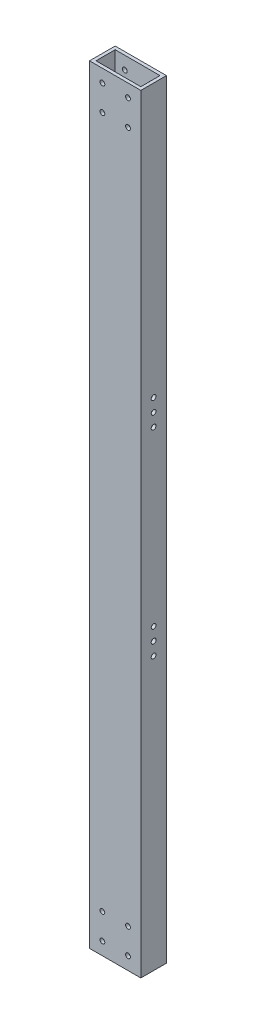
ISO-10303-21;
HEADER;
FILE_DESCRIPTION(('STEP AP214'),'2;1');
FILE_NAME('part.step','',(''),(''),'','','');
FILE_SCHEMA(('AUTOMOTIVE_DESIGN { 1 0 10303 214 1 1 1 1 }'));
ENDSEC;
DATA;
#1=APPLICATION_CONTEXT('core data for automotive mechanical design processes');
#2=APPLICATION_PROTOCOL_DEFINITION('international standard','automotive_design',2000,#1);
#3=PRODUCT_CONTEXT('',#1,'mechanical');
#4=PRODUCT('Part','Part','',(#3));
#5=PRODUCT_RELATED_PRODUCT_CATEGORY('part','',(#4));
#6=PRODUCT_DEFINITION_FORMATION('','',#4);
#7=PRODUCT_DEFINITION_CONTEXT('part definition',#1,'design');
#8=PRODUCT_DEFINITION('design','',#6,#7);
#9=PRODUCT_DEFINITION_SHAPE('','',#8);
#10=(LENGTH_UNIT() NAMED_UNIT(*) SI_UNIT(.MILLI.,.METRE.));
#11=(NAMED_UNIT(*) PLANE_ANGLE_UNIT() SI_UNIT($,.RADIAN.));
#12=(NAMED_UNIT(*) SI_UNIT($,.STERADIAN.) SOLID_ANGLE_UNIT());
#13=UNCERTAINTY_MEASURE_WITH_UNIT(LENGTH_MEASURE(1.E-05),#10,'distance_accuracy_value','');
#14=(GEOMETRIC_REPRESENTATION_CONTEXT(3) GLOBAL_UNCERTAINTY_ASSIGNED_CONTEXT((#13)) GLOBAL_UNIT_ASSIGNED_CONTEXT((#10,
#11,#12)) REPRESENTATION_CONTEXT('',''));
#15=CARTESIAN_POINT('',(0.,0.,0.));
#16=DIRECTION('',(0.,0.,1.));
#17=DIRECTION('',(1.,0.,0.));
#18=AXIS2_PLACEMENT_3D('',#15,#16,#17);
#19=CARTESIAN_POINT('',(0.,381.,0.));
#20=DIRECTION('',(0.,-1.,0.));
#21=DIRECTION('',(0.,0.,-1.));
#22=AXIS2_PLACEMENT_3D('',#19,#20,#21);
#23=PLANE('',#22);
#24=DIRECTION('',(0.,0.,1.));
#25=VECTOR('',#24,1.);
#26=CARTESIAN_POINT('',(-25.4,381.,-12.7));
#27=LINE('',#26,#25);
#28=CARTESIAN_POINT('',(-25.4,381.,-12.7));
#29=VERTEX_POINT('',#28);
#30=CARTESIAN_POINT('',(-25.4,381.,12.7));
#31=VERTEX_POINT('',#30);
#32=EDGE_CURVE('E137',#29,#31,#27,.T.);
#33=ORIENTED_EDGE('',*,*,#32,.T.);
#34=DIRECTION('',(1.,0.,0.));
#35=VECTOR('',#34,1.);
#36=CARTESIAN_POINT('',(25.4,381.,12.7));
#37=LINE('',#36,#35);
#38=CARTESIAN_POINT('',(25.4,381.,12.7));
#39=VERTEX_POINT('',#38);
#40=EDGE_CURVE('E140',#31,#39,#37,.T.);
#41=ORIENTED_EDGE('',*,*,#40,.T.);
#42=DIRECTION('',(0.,0.,-1.));
#43=VECTOR('',#42,1.);
#44=CARTESIAN_POINT('',(25.4,381.,-12.7));
#45=LINE('',#44,#43);
#46=CARTESIAN_POINT('',(25.4,381.,-12.7));
#47=VERTEX_POINT('',#46);
#48=EDGE_CURVE('E143',#39,#47,#45,.T.);
#49=ORIENTED_EDGE('',*,*,#48,.T.);
#50=DIRECTION('',(-1.,0.,0.));
#51=VECTOR('',#50,1.);
#52=CARTESIAN_POINT('',(25.4,381.,-12.7));
#53=LINE('',#52,#51);
#54=EDGE_CURVE('E145',#47,#29,#53,.T.);
#55=ORIENTED_EDGE('',*,*,#54,.T.);
#56=EDGE_LOOP('',(#33,#41,#49,#55));
#57=FACE_BOUND('',#56,.T.);
#58=DIRECTION('',(0.,0.,1.));
#59=VECTOR('',#58,1.);
#60=CARTESIAN_POINT('',(-22.225,381.,0.));
#61=LINE('',#60,#59);
#62=CARTESIAN_POINT('',(-22.225,381.,-9.52500000000001));
#63=VERTEX_POINT('',#62);
#64=CARTESIAN_POINT('',(-22.225,381.,9.52500000000001));
#65=VERTEX_POINT('',#64);
#66=EDGE_CURVE('E125',#63,#65,#61,.T.);
#67=ORIENTED_EDGE('',*,*,#66,.F.);
#68=DIRECTION('',(-1.,0.,0.));
#69=VECTOR('',#68,1.);
#70=CARTESIAN_POINT('',(0.,381.,-9.52500000000001));
#71=LINE('',#70,#69);
#72=CARTESIAN_POINT('',(22.225,381.,-9.52500000000001));
#73=VERTEX_POINT('',#72);
#74=EDGE_CURVE('E109',#73,#63,#71,.T.);
#75=ORIENTED_EDGE('',*,*,#74,.F.);
#76=DIRECTION('',(0.,0.,-1.));
#77=VECTOR('',#76,1.);
#78=CARTESIAN_POINT('',(22.225,381.,0.));
#79=LINE('',#78,#77);
#80=CARTESIAN_POINT('',(22.225,381.,9.52500000000001));
#81=VERTEX_POINT('',#80);
#82=EDGE_CURVE('E134',#81,#73,#79,.T.);
#83=ORIENTED_EDGE('',*,*,#82,.F.);
#84=DIRECTION('',(1.,0.,0.));
#85=VECTOR('',#84,1.);
#86=CARTESIAN_POINT('',(0.,381.,9.52500000000001));
#87=LINE('',#86,#85);
#88=EDGE_CURVE('E127',#65,#81,#87,.T.);
#89=ORIENTED_EDGE('',*,*,#88,.F.);
#90=EDGE_LOOP('',(#67,#75,#83,#89));
#91=FACE_BOUND('',#90,.T.);
#92=ADVANCED_FACE('F37',(#57,#91),#23,.F.);
#93=CARTESIAN_POINT('',(0.,-381.,0.));
#94=DIRECTION('',(0.,-1.,0.));
#95=DIRECTION('',(0.,0.,-1.));
#96=AXIS2_PLACEMENT_3D('',#93,#94,#95);
#97=PLANE('',#96);
#98=DIRECTION('',(0.,0.,1.));
#99=VECTOR('',#98,1.);
#100=CARTESIAN_POINT('',(-25.4,-381.,-12.7));
#101=LINE('',#100,#99);
#102=CARTESIAN_POINT('',(-25.4,-381.,-12.7));
#103=VERTEX_POINT('',#102);
#104=CARTESIAN_POINT('',(-25.4,-381.,12.7));
#105=VERTEX_POINT('',#104);
#106=EDGE_CURVE('E148',#103,#105,#101,.T.);
#107=ORIENTED_EDGE('',*,*,#106,.F.);
#108=DIRECTION('',(-1.,0.,0.));
#109=VECTOR('',#108,1.);
#110=CARTESIAN_POINT('',(25.4,-381.,-12.7));
#111=LINE('',#110,#109);
#112=CARTESIAN_POINT('',(25.4,-381.,-12.7));
#113=VERTEX_POINT('',#112);
#114=EDGE_CURVE('E141',#113,#103,#111,.T.);
#115=ORIENTED_EDGE('',*,*,#114,.F.);
#116=DIRECTION('',(0.,0.,-1.));
#117=VECTOR('',#116,1.);
#118=CARTESIAN_POINT('',(25.4,-381.,-12.7));
#119=LINE('',#118,#117);
#120=CARTESIAN_POINT('',(25.4,-381.,12.7));
#121=VERTEX_POINT('',#120);
#122=EDGE_CURVE('E153',#121,#113,#119,.T.);
#123=ORIENTED_EDGE('',*,*,#122,.F.);
#124=DIRECTION('',(1.,0.,0.));
#125=VECTOR('',#124,1.);
#126=CARTESIAN_POINT('',(25.4,-381.,12.7));
#127=LINE('',#126,#125);
#128=EDGE_CURVE('E151',#105,#121,#127,.T.);
#129=ORIENTED_EDGE('',*,*,#128,.F.);
#130=EDGE_LOOP('',(#107,#115,#123,#129));
#131=FACE_BOUND('',#130,.T.);
#132=DIRECTION('',(-1.,0.,0.));
#133=VECTOR('',#132,1.);
#134=CARTESIAN_POINT('',(0.,-381.,-9.52500000000001));
#135=LINE('',#134,#133);
#136=CARTESIAN_POINT('',(22.225,-381.,-9.52500000000001));
#137=VERTEX_POINT('',#136);
#138=CARTESIAN_POINT('',(-22.225,-381.,-9.52500000000001));
#139=VERTEX_POINT('',#138);
#140=EDGE_CURVE('E107',#137,#139,#135,.T.);
#141=ORIENTED_EDGE('',*,*,#140,.T.);
#142=DIRECTION('',(0.,0.,1.));
#143=VECTOR('',#142,1.);
#144=CARTESIAN_POINT('',(-22.225,-381.,0.));
#145=LINE('',#144,#143);
#146=CARTESIAN_POINT('',(-22.225,-381.,9.52500000000001));
#147=VERTEX_POINT('',#146);
#148=EDGE_CURVE('E115',#139,#147,#145,.T.);
#149=ORIENTED_EDGE('',*,*,#148,.T.);
#150=DIRECTION('',(1.,0.,0.));
#151=VECTOR('',#150,1.);
#152=CARTESIAN_POINT('',(0.,-381.,9.52500000000001));
#153=LINE('',#152,#151);
#154=CARTESIAN_POINT('',(22.225,-381.,9.52500000000001));
#155=VERTEX_POINT('',#154);
#156=EDGE_CURVE('E121',#147,#155,#153,.T.);
#157=ORIENTED_EDGE('',*,*,#156,.T.);
#158=DIRECTION('',(0.,0.,-1.));
#159=VECTOR('',#158,1.);
#160=CARTESIAN_POINT('',(22.225,-381.,0.));
#161=LINE('',#160,#159);
#162=EDGE_CURVE('E61',#155,#137,#161,.T.);
#163=ORIENTED_EDGE('',*,*,#162,.T.);
#164=EDGE_LOOP('',(#141,#149,#157,#163));
#165=FACE_BOUND('',#164,.T.);
#166=ADVANCED_FACE('F124',(#131,#165),#97,.T.);
#167=CARTESIAN_POINT('',(-25.4,381.,-12.7));
#168=DIRECTION('',(1.,0.,0.));
#169=DIRECTION('',(0.,0.,-1.));
#170=AXIS2_PLACEMENT_3D('',#167,#168,#169);
#171=PLANE('',#170);
#172=CARTESIAN_POINT('',(-25.4,110.9345,0.));
#173=DIRECTION('',(1.,0.,0.));
#174=DIRECTION('',(0.,0.,-1.));
#175=AXIS2_PLACEMENT_3D('',#172,#173,#174);
#176=CIRCLE('',#175,2.38125);
#177=CARTESIAN_POINT('',(-25.4,110.9345,-2.38124999999999));
#178=VERTEX_POINT('',#177);
#179=EDGE_CURVE('E167',#178,#178,#176,.T.);
#180=ORIENTED_EDGE('',*,*,#179,.T.);
#181=EDGE_LOOP('',(#180));
#182=FACE_BOUND('',#181,.T.);
#183=CARTESIAN_POINT('',(-25.4,98.2345,0.));
#184=DIRECTION('',(1.,0.,0.));
#185=DIRECTION('',(0.,0.,-1.));
#186=AXIS2_PLACEMENT_3D('',#183,#184,#185);
#187=CIRCLE('',#186,2.38125);
#188=CARTESIAN_POINT('',(-25.4,98.2345,-2.38124999999999));
#189=VERTEX_POINT('',#188);
#190=EDGE_CURVE('E237',#189,#189,#187,.T.);
#191=ORIENTED_EDGE('',*,*,#190,.T.);
#192=EDGE_LOOP('',(#191));
#193=FACE_BOUND('',#192,.T.);
#194=CARTESIAN_POINT('',(-25.4,85.5345,0.));
#195=DIRECTION('',(1.,0.,0.));
#196=DIRECTION('',(0.,0.,-1.));
#197=AXIS2_PLACEMENT_3D('',#194,#195,#196);
#198=CIRCLE('',#197,2.38125);
#199=CARTESIAN_POINT('',(-25.4,85.5345,-2.38124999999999));
#200=VERTEX_POINT('',#199);
#201=EDGE_CURVE('E243',#200,#200,#198,.T.);
#202=ORIENTED_EDGE('',*,*,#201,.T.);
#203=EDGE_LOOP('',(#202));
#204=FACE_BOUND('',#203,.T.);
#205=CARTESIAN_POINT('',(-25.4,-85.5345,0.));
#206=DIRECTION('',(1.,0.,0.));
#207=DIRECTION('',(0.,0.,1.));
#208=AXIS2_PLACEMENT_3D('',#205,#206,#207);
#209=CIRCLE('',#208,2.38125);
#210=CARTESIAN_POINT('',(-25.4,-85.5345,2.38125));
#211=VERTEX_POINT('',#210);
#212=EDGE_CURVE('E249',#211,#211,#209,.T.);
#213=ORIENTED_EDGE('',*,*,#212,.T.);
#214=EDGE_LOOP('',(#213));
#215=FACE_BOUND('',#214,.T.);
#216=CARTESIAN_POINT('',(-25.4,-98.2345,0.));
#217=DIRECTION('',(1.,0.,0.));
#218=DIRECTION('',(0.,0.,1.));
#219=AXIS2_PLACEMENT_3D('',#216,#217,#218);
#220=CIRCLE('',#219,2.38125);
#221=CARTESIAN_POINT('',(-25.4,-98.2345,2.38125));
#222=VERTEX_POINT('',#221);
#223=EDGE_CURVE('E255',#222,#222,#220,.T.);
#224=ORIENTED_EDGE('',*,*,#223,.T.);
#225=EDGE_LOOP('',(#224));
#226=FACE_BOUND('',#225,.T.);
#227=CARTESIAN_POINT('',(-25.4,-110.9345,0.));
#228=DIRECTION('',(1.,0.,0.));
#229=DIRECTION('',(0.,0.,1.));
#230=AXIS2_PLACEMENT_3D('',#227,#228,#229);
#231=CIRCLE('',#230,2.38125);
#232=CARTESIAN_POINT('',(-25.4,-110.9345,2.38125));
#233=VERTEX_POINT('',#232);
#234=EDGE_CURVE('E228',#233,#233,#231,.T.);
#235=ORIENTED_EDGE('',*,*,#234,.T.);
#236=EDGE_LOOP('',(#235));
#237=FACE_BOUND('',#236,.T.);
#238=ORIENTED_EDGE('',*,*,#106,.T.);
#239=DIRECTION('',(0.,-1.,0.));
#240=VECTOR('',#239,1.);
#241=CARTESIAN_POINT('',(-25.4,381.,12.7));
#242=LINE('',#241,#240);
#243=EDGE_CURVE('E11',#31,#105,#242,.T.);
#244=ORIENTED_EDGE('',*,*,#243,.F.);
#245=ORIENTED_EDGE('',*,*,#32,.F.);
#246=DIRECTION('',(0.,-1.,0.));
#247=VECTOR('',#246,1.);
#248=CARTESIAN_POINT('',(-25.4,381.,-12.7));
#249=LINE('',#248,#247);
#250=EDGE_CURVE('E147',#29,#103,#249,.T.);
#251=ORIENTED_EDGE('',*,*,#250,.T.);
#252=EDGE_LOOP('',(#238,#244,#245,#251));
#253=FACE_BOUND('',#252,.T.);
#254=ADVANCED_FACE('F39',(#182,#193,#204,#215,#226,#237,#253),#171,.F.);
#255=CARTESIAN_POINT('',(25.4,381.,12.7));
#256=DIRECTION('',(0.,0.,-1.));
#257=DIRECTION('',(-1.,0.,0.));
#258=AXIS2_PLACEMENT_3D('',#255,#256,#257);
#259=PLANE('',#258);
#260=CARTESIAN_POINT('',(12.7,368.3,12.7));
#261=DIRECTION('',(0.,0.,1.));
#262=DIRECTION('',(1.,0.,0.));
#263=AXIS2_PLACEMENT_3D('',#260,#261,#262);
#264=CIRCLE('',#263,2.38125000000003);
#265=CARTESIAN_POINT('',(15.08125,368.3,12.7));
#266=VERTEX_POINT('',#265);
#267=EDGE_CURVE('E325',#266,#266,#264,.T.);
#268=ORIENTED_EDGE('',*,*,#267,.F.);
#269=EDGE_LOOP('',(#268));
#270=FACE_BOUND('',#269,.T.);
#271=CARTESIAN_POINT('',(12.7,342.9,12.7));
#272=DIRECTION('',(0.,0.,1.));
#273=DIRECTION('',(1.,0.,0.));
#274=AXIS2_PLACEMENT_3D('',#271,#272,#273);
#275=CIRCLE('',#274,2.38125000000003);
#276=CARTESIAN_POINT('',(15.08125,342.9,12.7));
#277=VERTEX_POINT('',#276);
#278=EDGE_CURVE('E329',#277,#277,#275,.T.);
#279=ORIENTED_EDGE('',*,*,#278,.F.);
#280=EDGE_LOOP('',(#279));
#281=FACE_BOUND('',#280,.T.);
#282=CARTESIAN_POINT('',(-12.7,342.9,12.7));
#283=DIRECTION('',(0.,0.,1.));
#284=DIRECTION('',(1.,0.,0.));
#285=AXIS2_PLACEMENT_3D('',#282,#283,#284);
#286=CIRCLE('',#285,2.38125000000003);
#287=CARTESIAN_POINT('',(-10.31875,342.9,12.7));
#288=VERTEX_POINT('',#287);
#289=EDGE_CURVE('E333',#288,#288,#286,.T.);
#290=ORIENTED_EDGE('',*,*,#289,.F.);
#291=EDGE_LOOP('',(#290));
#292=FACE_BOUND('',#291,.T.);
#293=CARTESIAN_POINT('',(-12.7,-342.9,12.7));
#294=DIRECTION('',(0.,0.,1.));
#295=DIRECTION('',(-1.,0.,0.));
#296=AXIS2_PLACEMENT_3D('',#293,#294,#295);
#297=CIRCLE('',#296,2.38125000000003);
#298=CARTESIAN_POINT('',(-15.08125,-342.9,12.7));
#299=VERTEX_POINT('',#298);
#300=EDGE_CURVE('E337',#299,#299,#297,.T.);
#301=ORIENTED_EDGE('',*,*,#300,.F.);
#302=EDGE_LOOP('',(#301));
#303=FACE_BOUND('',#302,.T.);
#304=CARTESIAN_POINT('',(12.7,-342.9,12.7));
#305=DIRECTION('',(0.,0.,1.));
#306=DIRECTION('',(-1.,0.,0.));
#307=AXIS2_PLACEMENT_3D('',#304,#305,#306);
#308=CIRCLE('',#307,2.38125000000003);
#309=CARTESIAN_POINT('',(10.31875,-342.9,12.7));
#310=VERTEX_POINT('',#309);
#311=EDGE_CURVE('E341',#310,#310,#308,.T.);
#312=ORIENTED_EDGE('',*,*,#311,.F.);
#313=EDGE_LOOP('',(#312));
#314=FACE_BOUND('',#313,.T.);
#315=CARTESIAN_POINT('',(12.7,-368.3,12.7));
#316=DIRECTION('',(0.,0.,1.));
#317=DIRECTION('',(-1.,0.,0.));
#318=AXIS2_PLACEMENT_3D('',#315,#316,#317);
#319=CIRCLE('',#318,2.38125000000003);
#320=CARTESIAN_POINT('',(10.31875,-368.3,12.7));
#321=VERTEX_POINT('',#320);
#322=EDGE_CURVE('E345',#321,#321,#319,.T.);
#323=ORIENTED_EDGE('',*,*,#322,.F.);
#324=EDGE_LOOP('',(#323));
#325=FACE_BOUND('',#324,.T.);
#326=CARTESIAN_POINT('',(-12.7,-368.3,12.7));
#327=DIRECTION('',(0.,0.,1.));
#328=DIRECTION('',(-1.,0.,0.));
#329=AXIS2_PLACEMENT_3D('',#326,#327,#328);
#330=CIRCLE('',#329,2.38125000000003);
#331=CARTESIAN_POINT('',(-15.08125,-368.3,12.7));
#332=VERTEX_POINT('',#331);
#333=EDGE_CURVE('E349',#332,#332,#330,.T.);
#334=ORIENTED_EDGE('',*,*,#333,.F.);
#335=EDGE_LOOP('',(#334));
#336=FACE_BOUND('',#335,.T.);
#337=CARTESIAN_POINT('',(-12.7,368.3,12.7));
#338=DIRECTION('',(0.,0.,1.));
#339=DIRECTION('',(1.,0.,0.));
#340=AXIS2_PLACEMENT_3D('',#337,#338,#339);
#341=CIRCLE('',#340,2.38125000000003);
#342=CARTESIAN_POINT('',(-10.31875,368.3,12.7));
#343=VERTEX_POINT('',#342);
#344=EDGE_CURVE('E353',#343,#343,#341,.T.);
#345=ORIENTED_EDGE('',*,*,#344,.F.);
#346=EDGE_LOOP('',(#345));
#347=FACE_BOUND('',#346,.T.);
#348=ORIENTED_EDGE('',*,*,#128,.T.);
#349=DIRECTION('',(0.,-1.,0.));
#350=VECTOR('',#349,1.);
#351=CARTESIAN_POINT('',(25.4,381.,12.7));
#352=LINE('',#351,#350);
#353=EDGE_CURVE('E46',#39,#121,#352,.T.);
#354=ORIENTED_EDGE('',*,*,#353,.F.);
#355=ORIENTED_EDGE('',*,*,#40,.F.);
#356=ORIENTED_EDGE('',*,*,#243,.T.);
#357=EDGE_LOOP('',(#348,#354,#355,#356));
#358=FACE_BOUND('',#357,.T.);
#359=ADVANCED_FACE('F313',(#270,#281,#292,#303,#314,#325,#336,#347,#358),#259,.F.);
#360=CARTESIAN_POINT('',(25.4,381.,-12.7));
#361=DIRECTION('',(-1.,0.,0.));
#362=DIRECTION('',(0.,0.,1.));
#363=AXIS2_PLACEMENT_3D('',#360,#361,#362);
#364=PLANE('',#363);
#365=CARTESIAN_POINT('',(25.4,110.9345,0.));
#366=DIRECTION('',(1.,0.,0.));
#367=DIRECTION('',(0.,0.,-1.));
#368=AXIS2_PLACEMENT_3D('',#365,#366,#367);
#369=CIRCLE('',#368,2.38125);
#370=CARTESIAN_POINT('',(25.4,110.9345,-2.38125));
#371=VERTEX_POINT('',#370);
#372=EDGE_CURVE('E231',#371,#371,#369,.T.);
#373=ORIENTED_EDGE('',*,*,#372,.F.);
#374=EDGE_LOOP('',(#373));
#375=FACE_BOUND('',#374,.T.);
#376=CARTESIAN_POINT('',(25.4,98.2345,0.));
#377=DIRECTION('',(1.,0.,0.));
#378=DIRECTION('',(0.,0.,-1.));
#379=AXIS2_PLACEMENT_3D('',#376,#377,#378);
#380=CIRCLE('',#379,2.38125);
#381=CARTESIAN_POINT('',(25.4,98.2345,-2.38125));
#382=VERTEX_POINT('',#381);
#383=EDGE_CURVE('E234',#382,#382,#380,.T.);
#384=ORIENTED_EDGE('',*,*,#383,.F.);
#385=EDGE_LOOP('',(#384));
#386=FACE_BOUND('',#385,.T.);
#387=CARTESIAN_POINT('',(25.4,85.5345,0.));
#388=DIRECTION('',(1.,0.,0.));
#389=DIRECTION('',(0.,0.,-1.));
#390=AXIS2_PLACEMENT_3D('',#387,#388,#389);
#391=CIRCLE('',#390,2.38125);
#392=CARTESIAN_POINT('',(25.4,85.5345,-2.38125));
#393=VERTEX_POINT('',#392);
#394=EDGE_CURVE('E240',#393,#393,#391,.T.);
#395=ORIENTED_EDGE('',*,*,#394,.F.);
#396=EDGE_LOOP('',(#395));
#397=FACE_BOUND('',#396,.T.);
#398=CARTESIAN_POINT('',(25.4,-85.5345,0.));
#399=DIRECTION('',(1.,0.,0.));
#400=DIRECTION('',(0.,0.,1.));
#401=AXIS2_PLACEMENT_3D('',#398,#399,#400);
#402=CIRCLE('',#401,2.38125);
#403=CARTESIAN_POINT('',(25.4,-85.5345,2.38125));
#404=VERTEX_POINT('',#403);
#405=EDGE_CURVE('E246',#404,#404,#402,.T.);
#406=ORIENTED_EDGE('',*,*,#405,.F.);
#407=EDGE_LOOP('',(#406));
#408=FACE_BOUND('',#407,.T.);
#409=CARTESIAN_POINT('',(25.4,-98.2345,0.));
#410=DIRECTION('',(1.,0.,0.));
#411=DIRECTION('',(0.,0.,1.));
#412=AXIS2_PLACEMENT_3D('',#409,#410,#411);
#413=CIRCLE('',#412,2.38125);
#414=CARTESIAN_POINT('',(25.4,-98.2345,2.38124999999999));
#415=VERTEX_POINT('',#414);
#416=EDGE_CURVE('E252',#415,#415,#413,.T.);
#417=ORIENTED_EDGE('',*,*,#416,.F.);
#418=EDGE_LOOP('',(#417));
#419=FACE_BOUND('',#418,.T.);
#420=CARTESIAN_POINT('',(25.4,-110.9345,0.));
#421=DIRECTION('',(1.,0.,0.));
#422=DIRECTION('',(0.,0.,1.));
#423=AXIS2_PLACEMENT_3D('',#420,#421,#422);
#424=CIRCLE('',#423,2.38125);
#425=CARTESIAN_POINT('',(25.4,-110.9345,2.38124999999999));
#426=VERTEX_POINT('',#425);
#427=EDGE_CURVE('E258',#426,#426,#424,.T.);
#428=ORIENTED_EDGE('',*,*,#427,.F.);
#429=EDGE_LOOP('',(#428));
#430=FACE_BOUND('',#429,.T.);
#431=ORIENTED_EDGE('',*,*,#122,.T.);
#432=DIRECTION('',(0.,-1.,0.));
#433=VECTOR('',#432,1.);
#434=CARTESIAN_POINT('',(25.4,381.,-12.7));
#435=LINE('',#434,#433);
#436=EDGE_CURVE('E158',#47,#113,#435,.T.);
#437=ORIENTED_EDGE('',*,*,#436,.F.);
#438=ORIENTED_EDGE('',*,*,#48,.F.);
#439=ORIENTED_EDGE('',*,*,#353,.T.);
#440=EDGE_LOOP('',(#431,#437,#438,#439));
#441=FACE_BOUND('',#440,.T.);
#442=ADVANCED_FACE('F310',(#375,#386,#397,#408,#419,#430,#441),#364,.F.);
#443=CARTESIAN_POINT('',(25.4,381.,-12.7));
#444=DIRECTION('',(0.,0.,1.));
#445=DIRECTION('',(1.,0.,0.));
#446=AXIS2_PLACEMENT_3D('',#443,#444,#445);
#447=PLANE('',#446);
#448=CARTESIAN_POINT('',(12.7,368.3,-12.7));
#449=DIRECTION('',(0.,0.,1.));
#450=DIRECTION('',(1.,0.,0.));
#451=AXIS2_PLACEMENT_3D('',#448,#449,#450);
#452=CIRCLE('',#451,2.38125000000003);
#453=CARTESIAN_POINT('',(15.08125,368.3,-12.7));
#454=VERTEX_POINT('',#453);
#455=EDGE_CURVE('E371',#454,#454,#452,.T.);
#456=ORIENTED_EDGE('',*,*,#455,.T.);
#457=EDGE_LOOP('',(#456));
#458=FACE_BOUND('',#457,.T.);
#459=CARTESIAN_POINT('',(12.7,342.9,-12.7));
#460=DIRECTION('',(0.,0.,1.));
#461=DIRECTION('',(1.,0.,0.));
#462=AXIS2_PLACEMENT_3D('',#459,#460,#461);
#463=CIRCLE('',#462,2.38125000000003);
#464=CARTESIAN_POINT('',(15.08125,342.9,-12.7));
#465=VERTEX_POINT('',#464);
#466=EDGE_CURVE('E465',#465,#465,#463,.T.);
#467=ORIENTED_EDGE('',*,*,#466,.T.);
#468=EDGE_LOOP('',(#467));
#469=FACE_BOUND('',#468,.T.);
#470=CARTESIAN_POINT('',(-12.7,342.9,-12.7));
#471=DIRECTION('',(0.,0.,1.));
#472=DIRECTION('',(1.,0.,0.));
#473=AXIS2_PLACEMENT_3D('',#470,#471,#472);
#474=CIRCLE('',#473,2.38125000000003);
#475=CARTESIAN_POINT('',(-10.31875,342.9,-12.7));
#476=VERTEX_POINT('',#475);
#477=EDGE_CURVE('E469',#476,#476,#474,.T.);
#478=ORIENTED_EDGE('',*,*,#477,.T.);
#479=EDGE_LOOP('',(#478));
#480=FACE_BOUND('',#479,.T.);
#481=CARTESIAN_POINT('',(-12.7,-342.9,-12.7));
#482=DIRECTION('',(0.,0.,1.));
#483=DIRECTION('',(-1.,0.,0.));
#484=AXIS2_PLACEMENT_3D('',#481,#482,#483);
#485=CIRCLE('',#484,2.38125000000003);
#486=CARTESIAN_POINT('',(-15.08125,-342.9,-12.7));
#487=VERTEX_POINT('',#486);
#488=EDGE_CURVE('E472',#487,#487,#485,.T.);
#489=ORIENTED_EDGE('',*,*,#488,.T.);
#490=EDGE_LOOP('',(#489));
#491=FACE_BOUND('',#490,.T.);
#492=CARTESIAN_POINT('',(12.7,-342.9,-12.7));
#493=DIRECTION('',(0.,0.,1.));
#494=DIRECTION('',(-1.,0.,0.));
#495=AXIS2_PLACEMENT_3D('',#492,#493,#494);
#496=CIRCLE('',#495,2.38125000000003);
#497=CARTESIAN_POINT('',(10.31875,-342.9,-12.7));
#498=VERTEX_POINT('',#497);
#499=EDGE_CURVE('E476',#498,#498,#496,.T.);
#500=ORIENTED_EDGE('',*,*,#499,.T.);
#501=EDGE_LOOP('',(#500));
#502=FACE_BOUND('',#501,.T.);
#503=CARTESIAN_POINT('',(12.7,-368.3,-12.7));
#504=DIRECTION('',(0.,0.,1.));
#505=DIRECTION('',(-1.,0.,0.));
#506=AXIS2_PLACEMENT_3D('',#503,#504,#505);
#507=CIRCLE('',#506,2.38125000000003);
#508=CARTESIAN_POINT('',(10.31875,-368.3,-12.7));
#509=VERTEX_POINT('',#508);
#510=EDGE_CURVE('E458',#509,#509,#507,.T.);
#511=ORIENTED_EDGE('',*,*,#510,.T.);
#512=EDGE_LOOP('',(#511));
#513=FACE_BOUND('',#512,.T.);
#514=CARTESIAN_POINT('',(-12.7,-368.3,-12.7));
#515=DIRECTION('',(0.,0.,1.));
#516=DIRECTION('',(-1.,0.,0.));
#517=AXIS2_PLACEMENT_3D('',#514,#515,#516);
#518=CIRCLE('',#517,2.38125000000003);
#519=CARTESIAN_POINT('',(-15.08125,-368.3,-12.7));
#520=VERTEX_POINT('',#519);
#521=EDGE_CURVE('E455',#520,#520,#518,.T.);
#522=ORIENTED_EDGE('',*,*,#521,.T.);
#523=EDGE_LOOP('',(#522));
#524=FACE_BOUND('',#523,.T.);
#525=CARTESIAN_POINT('',(-12.7,368.3,-12.7));
#526=DIRECTION('',(0.,0.,1.));
#527=DIRECTION('',(1.,0.,0.));
#528=AXIS2_PLACEMENT_3D('',#525,#526,#527);
#529=CIRCLE('',#528,2.38125000000003);
#530=CARTESIAN_POINT('',(-10.31875,368.3,-12.7));
#531=VERTEX_POINT('',#530);
#532=EDGE_CURVE('E191',#531,#531,#529,.T.);
#533=ORIENTED_EDGE('',*,*,#532,.T.);
#534=EDGE_LOOP('',(#533));
#535=FACE_BOUND('',#534,.T.);
#536=ORIENTED_EDGE('',*,*,#114,.T.);
#537=ORIENTED_EDGE('',*,*,#250,.F.);
#538=ORIENTED_EDGE('',*,*,#54,.F.);
#539=ORIENTED_EDGE('',*,*,#436,.T.);
#540=EDGE_LOOP('',(#536,#537,#538,#539));
#541=FACE_BOUND('',#540,.T.);
#542=ADVANCED_FACE('F294',(#458,#469,#480,#491,#502,#513,#524,#535,#541),#447,.F.);
#543=CARTESIAN_POINT('',(-22.225,381.,-12.7));
#544=DIRECTION('',(1.,0.,0.));
#545=DIRECTION('',(0.,0.,-1.));
#546=AXIS2_PLACEMENT_3D('',#543,#544,#545);
#547=PLANE('',#546);
#548=CARTESIAN_POINT('',(-22.225,110.9345,0.));
#549=DIRECTION('',(1.,0.,0.));
#550=DIRECTION('',(0.,0.,-1.));
#551=AXIS2_PLACEMENT_3D('',#548,#549,#550);
#552=CIRCLE('',#551,2.38125);
#553=CARTESIAN_POINT('',(-22.225,110.9345,-2.38124999999999));
#554=VERTEX_POINT('',#553);
#555=EDGE_CURVE('E122',#554,#554,#552,.T.);
#556=ORIENTED_EDGE('',*,*,#555,.F.);
#557=EDGE_LOOP('',(#556));
#558=FACE_BOUND('',#557,.T.);
#559=CARTESIAN_POINT('',(-22.225,98.2345,0.));
#560=DIRECTION('',(1.,0.,0.));
#561=DIRECTION('',(0.,0.,-1.));
#562=AXIS2_PLACEMENT_3D('',#559,#560,#561);
#563=CIRCLE('',#562,2.38125);
#564=CARTESIAN_POINT('',(-22.225,98.2345,-2.38124999999999));
#565=VERTEX_POINT('',#564);
#566=EDGE_CURVE('E183',#565,#565,#563,.T.);
#567=ORIENTED_EDGE('',*,*,#566,.F.);
#568=EDGE_LOOP('',(#567));
#569=FACE_BOUND('',#568,.T.);
#570=CARTESIAN_POINT('',(-22.225,85.5345,0.));
#571=DIRECTION('',(1.,0.,0.));
#572=DIRECTION('',(0.,0.,-1.));
#573=AXIS2_PLACEMENT_3D('',#570,#571,#572);
#574=CIRCLE('',#573,2.38125);
#575=CARTESIAN_POINT('',(-22.225,85.5345,-2.38124999999999));
#576=VERTEX_POINT('',#575);
#577=EDGE_CURVE('E179',#576,#576,#574,.T.);
#578=ORIENTED_EDGE('',*,*,#577,.F.);
#579=EDGE_LOOP('',(#578));
#580=FACE_BOUND('',#579,.T.);
#581=CARTESIAN_POINT('',(-22.225,-85.5345,0.));
#582=DIRECTION('',(1.,0.,0.));
#583=DIRECTION('',(0.,0.,-1.));
#584=AXIS2_PLACEMENT_3D('',#581,#582,#583);
#585=CIRCLE('',#584,2.38125);
#586=CARTESIAN_POINT('',(-22.225,-85.5345,-2.38124999999999));
#587=VERTEX_POINT('',#586);
#588=EDGE_CURVE('E175',#587,#587,#585,.T.);
#589=ORIENTED_EDGE('',*,*,#588,.F.);
#590=EDGE_LOOP('',(#589));
#591=FACE_BOUND('',#590,.T.);
#592=CARTESIAN_POINT('',(-22.225,-98.2345,0.));
#593=DIRECTION('',(1.,0.,0.));
#594=DIRECTION('',(0.,0.,-1.));
#595=AXIS2_PLACEMENT_3D('',#592,#593,#594);
#596=CIRCLE('',#595,2.38125);
#597=CARTESIAN_POINT('',(-22.225,-98.2345,-2.38124999999999));
#598=VERTEX_POINT('',#597);
#599=EDGE_CURVE('E171',#598,#598,#596,.T.);
#600=ORIENTED_EDGE('',*,*,#599,.F.);
#601=EDGE_LOOP('',(#600));
#602=FACE_BOUND('',#601,.T.);
#603=CARTESIAN_POINT('',(-22.225,-110.9345,0.));
#604=DIRECTION('',(1.,0.,0.));
#605=DIRECTION('',(0.,0.,-1.));
#606=AXIS2_PLACEMENT_3D('',#603,#604,#605);
#607=CIRCLE('',#606,2.38125);
#608=CARTESIAN_POINT('',(-22.225,-110.9345,-2.38124999999999));
#609=VERTEX_POINT('',#608);
#610=EDGE_CURVE('E166',#609,#609,#607,.T.);
#611=ORIENTED_EDGE('',*,*,#610,.F.);
#612=EDGE_LOOP('',(#611));
#613=FACE_BOUND('',#612,.T.);
#614=ORIENTED_EDGE('',*,*,#148,.F.);
#615=DIRECTION('',(0.,-1.,0.));
#616=VECTOR('',#615,1.);
#617=CARTESIAN_POINT('',(-22.225,381.,-9.52500000000001));
#618=LINE('',#617,#616);
#619=EDGE_CURVE('E103',#63,#139,#618,.T.);
#620=ORIENTED_EDGE('',*,*,#619,.F.);
#621=ORIENTED_EDGE('',*,*,#66,.T.);
#622=DIRECTION('',(0.,-1.,0.));
#623=VECTOR('',#622,1.);
#624=CARTESIAN_POINT('',(-22.225,381.,9.52500000000001));
#625=LINE('',#624,#623);
#626=EDGE_CURVE('E118',#65,#147,#625,.T.);
#627=ORIENTED_EDGE('',*,*,#626,.T.);
#628=EDGE_LOOP('',(#614,#620,#621,#627));
#629=FACE_BOUND('',#628,.T.);
#630=ADVANCED_FACE('F116',(#558,#569,#580,#591,#602,#613,#629),#547,.T.);
#631=CARTESIAN_POINT('',(25.4,381.,9.52500000000001));
#632=DIRECTION('',(0.,0.,-1.));
#633=DIRECTION('',(-1.,0.,0.));
#634=AXIS2_PLACEMENT_3D('',#631,#632,#633);
#635=PLANE('',#634);
#636=CARTESIAN_POINT('',(12.7,368.3,9.52500000000001));
#637=DIRECTION('',(0.,0.,-1.));
#638=DIRECTION('',(-1.,0.,0.));
#639=AXIS2_PLACEMENT_3D('',#636,#637,#638);
#640=CIRCLE('',#639,2.38125000000003);
#641=CARTESIAN_POINT('',(10.31875,368.3,9.52500000000001));
#642=VERTEX_POINT('',#641);
#643=EDGE_CURVE('E225',#642,#642,#640,.T.);
#644=ORIENTED_EDGE('',*,*,#643,.F.);
#645=EDGE_LOOP('',(#644));
#646=FACE_BOUND('',#645,.T.);
#647=CARTESIAN_POINT('',(12.7,342.9,9.52500000000001));
#648=DIRECTION('',(0.,0.,-1.));
#649=DIRECTION('',(-1.,0.,0.));
#650=AXIS2_PLACEMENT_3D('',#647,#648,#649);
#651=CIRCLE('',#650,2.38125000000003);
#652=CARTESIAN_POINT('',(10.31875,342.9,9.52500000000001));
#653=VERTEX_POINT('',#652);
#654=EDGE_CURVE('E213',#653,#653,#651,.T.);
#655=ORIENTED_EDGE('',*,*,#654,.F.);
#656=EDGE_LOOP('',(#655));
#657=FACE_BOUND('',#656,.T.);
#658=CARTESIAN_POINT('',(-12.7,342.9,9.52500000000001));
#659=DIRECTION('',(0.,0.,-1.));
#660=DIRECTION('',(-1.,0.,0.));
#661=AXIS2_PLACEMENT_3D('',#658,#659,#660);
#662=CIRCLE('',#661,2.38125000000003);
#663=CARTESIAN_POINT('',(-15.08125,342.9,9.52500000000001));
#664=VERTEX_POINT('',#663);
#665=EDGE_CURVE('E210',#664,#664,#662,.T.);
#666=ORIENTED_EDGE('',*,*,#665,.F.);
#667=EDGE_LOOP('',(#666));
#668=FACE_BOUND('',#667,.T.);
#669=CARTESIAN_POINT('',(-12.7,-342.9,9.52500000000001));
#670=DIRECTION('',(0.,0.,-1.));
#671=DIRECTION('',(-1.,0.,0.));
#672=AXIS2_PLACEMENT_3D('',#669,#670,#671);
#673=CIRCLE('',#672,2.38125000000003);
#674=CARTESIAN_POINT('',(-15.08125,-342.9,9.52500000000001));
#675=VERTEX_POINT('',#674);
#676=EDGE_CURVE('E207',#675,#675,#673,.T.);
#677=ORIENTED_EDGE('',*,*,#676,.F.);
#678=EDGE_LOOP('',(#677));
#679=FACE_BOUND('',#678,.T.);
#680=CARTESIAN_POINT('',(12.7,-342.9,9.52500000000001));
#681=DIRECTION('',(0.,0.,-1.));
#682=DIRECTION('',(-1.,0.,0.));
#683=AXIS2_PLACEMENT_3D('',#680,#681,#682);
#684=CIRCLE('',#683,2.38125000000003);
#685=CARTESIAN_POINT('',(10.31875,-342.9,9.52500000000001));
#686=VERTEX_POINT('',#685);
#687=EDGE_CURVE('E203',#686,#686,#684,.T.);
#688=ORIENTED_EDGE('',*,*,#687,.F.);
#689=EDGE_LOOP('',(#688));
#690=FACE_BOUND('',#689,.T.);
#691=CARTESIAN_POINT('',(12.7,-368.3,9.52500000000001));
#692=DIRECTION('',(0.,0.,-1.));
#693=DIRECTION('',(-1.,0.,0.));
#694=AXIS2_PLACEMENT_3D('',#691,#692,#693);
#695=CIRCLE('',#694,2.38125000000003);
#696=CARTESIAN_POINT('',(10.31875,-368.3,9.52500000000001));
#697=VERTEX_POINT('',#696);
#698=EDGE_CURVE('E199',#697,#697,#695,.T.);
#699=ORIENTED_EDGE('',*,*,#698,.F.);
#700=EDGE_LOOP('',(#699));
#701=FACE_BOUND('',#700,.T.);
#702=CARTESIAN_POINT('',(-12.7,-368.3,9.52500000000001));
#703=DIRECTION('',(0.,0.,-1.));
#704=DIRECTION('',(-1.,0.,0.));
#705=AXIS2_PLACEMENT_3D('',#702,#703,#704);
#706=CIRCLE('',#705,2.38125000000003);
#707=CARTESIAN_POINT('',(-15.08125,-368.3,9.52500000000001));
#708=VERTEX_POINT('',#707);
#709=EDGE_CURVE('E195',#708,#708,#706,.T.);
#710=ORIENTED_EDGE('',*,*,#709,.F.);
#711=EDGE_LOOP('',(#710));
#712=FACE_BOUND('',#711,.T.);
#713=CARTESIAN_POINT('',(-12.7,368.3,9.52500000000001));
#714=DIRECTION('',(0.,0.,-1.));
#715=DIRECTION('',(-1.,0.,0.));
#716=AXIS2_PLACEMENT_3D('',#713,#714,#715);
#717=CIRCLE('',#716,2.38125000000003);
#718=CARTESIAN_POINT('',(-15.08125,368.3,9.52500000000001));
#719=VERTEX_POINT('',#718);
#720=EDGE_CURVE('E190',#719,#719,#717,.T.);
#721=ORIENTED_EDGE('',*,*,#720,.F.);
#722=EDGE_LOOP('',(#721));
#723=FACE_BOUND('',#722,.T.);
#724=ORIENTED_EDGE('',*,*,#156,.F.);
#725=ORIENTED_EDGE('',*,*,#626,.F.);
#726=ORIENTED_EDGE('',*,*,#88,.T.);
#727=DIRECTION('',(0.,-1.,0.));
#728=VECTOR('',#727,1.);
#729=CARTESIAN_POINT('',(22.225,381.,9.52500000000001));
#730=LINE('',#729,#728);
#731=EDGE_CURVE('E275',#81,#155,#730,.T.);
#732=ORIENTED_EDGE('',*,*,#731,.T.);
#733=EDGE_LOOP('',(#724,#725,#726,#732));
#734=FACE_BOUND('',#733,.T.);
#735=ADVANCED_FACE('F282',(#646,#657,#668,#679,#690,#701,#712,#723,#734),#635,.T.);
#736=CARTESIAN_POINT('',(22.225,381.,-12.7));
#737=DIRECTION('',(-1.,0.,0.));
#738=DIRECTION('',(0.,0.,1.));
#739=AXIS2_PLACEMENT_3D('',#736,#737,#738);
#740=PLANE('',#739);
#741=CARTESIAN_POINT('',(22.225,110.9345,0.));
#742=DIRECTION('',(-1.,0.,0.));
#743=DIRECTION('',(0.,0.,1.));
#744=AXIS2_PLACEMENT_3D('',#741,#742,#743);
#745=CIRCLE('',#744,2.38125);
#746=CARTESIAN_POINT('',(22.225,110.9345,2.38124999999999));
#747=VERTEX_POINT('',#746);
#748=EDGE_CURVE('E184',#747,#747,#745,.T.);
#749=ORIENTED_EDGE('',*,*,#748,.F.);
#750=EDGE_LOOP('',(#749));
#751=FACE_BOUND('',#750,.T.);
#752=CARTESIAN_POINT('',(22.225,98.2345,0.));
#753=DIRECTION('',(-1.,0.,0.));
#754=DIRECTION('',(0.,0.,1.));
#755=AXIS2_PLACEMENT_3D('',#752,#753,#754);
#756=CIRCLE('',#755,2.38125);
#757=CARTESIAN_POINT('',(22.225,98.2345,2.38124999999999));
#758=VERTEX_POINT('',#757);
#759=EDGE_CURVE('E180',#758,#758,#756,.T.);
#760=ORIENTED_EDGE('',*,*,#759,.F.);
#761=EDGE_LOOP('',(#760));
#762=FACE_BOUND('',#761,.T.);
#763=CARTESIAN_POINT('',(22.225,85.5345,0.));
#764=DIRECTION('',(-1.,0.,0.));
#765=DIRECTION('',(0.,0.,1.));
#766=AXIS2_PLACEMENT_3D('',#763,#764,#765);
#767=CIRCLE('',#766,2.38125);
#768=CARTESIAN_POINT('',(22.225,85.5345,2.38125));
#769=VERTEX_POINT('',#768);
#770=EDGE_CURVE('E176',#769,#769,#767,.T.);
#771=ORIENTED_EDGE('',*,*,#770,.F.);
#772=EDGE_LOOP('',(#771));
#773=FACE_BOUND('',#772,.T.);
#774=CARTESIAN_POINT('',(22.225,-85.5345,0.));
#775=DIRECTION('',(-1.,0.,0.));
#776=DIRECTION('',(0.,0.,1.));
#777=AXIS2_PLACEMENT_3D('',#774,#775,#776);
#778=CIRCLE('',#777,2.38125);
#779=CARTESIAN_POINT('',(22.225,-85.5345,2.38125));
#780=VERTEX_POINT('',#779);
#781=EDGE_CURVE('E172',#780,#780,#778,.T.);
#782=ORIENTED_EDGE('',*,*,#781,.F.);
#783=EDGE_LOOP('',(#782));
#784=FACE_BOUND('',#783,.T.);
#785=CARTESIAN_POINT('',(22.225,-98.2345,0.));
#786=DIRECTION('',(-1.,0.,0.));
#787=DIRECTION('',(0.,0.,1.));
#788=AXIS2_PLACEMENT_3D('',#785,#786,#787);
#789=CIRCLE('',#788,2.38125);
#790=CARTESIAN_POINT('',(22.225,-98.2345,2.38124999999999));
#791=VERTEX_POINT('',#790);
#792=EDGE_CURVE('E168',#791,#791,#789,.T.);
#793=ORIENTED_EDGE('',*,*,#792,.F.);
#794=EDGE_LOOP('',(#793));
#795=FACE_BOUND('',#794,.T.);
#796=CARTESIAN_POINT('',(22.225,-110.9345,0.));
#797=DIRECTION('',(-1.,0.,0.));
#798=DIRECTION('',(0.,0.,1.));
#799=AXIS2_PLACEMENT_3D('',#796,#797,#798);
#800=CIRCLE('',#799,2.38125);
#801=CARTESIAN_POINT('',(22.225,-110.9345,2.38124999999999));
#802=VERTEX_POINT('',#801);
#803=EDGE_CURVE('E163',#802,#802,#800,.T.);
#804=ORIENTED_EDGE('',*,*,#803,.F.);
#805=EDGE_LOOP('',(#804));
#806=FACE_BOUND('',#805,.T.);
#807=ORIENTED_EDGE('',*,*,#162,.F.);
#808=ORIENTED_EDGE('',*,*,#731,.F.);
#809=ORIENTED_EDGE('',*,*,#82,.T.);
#810=DIRECTION('',(0.,-1.,0.));
#811=VECTOR('',#810,1.);
#812=CARTESIAN_POINT('',(22.225,381.,-9.52500000000001));
#813=LINE('',#812,#811);
#814=EDGE_CURVE('E54',#73,#137,#813,.T.);
#815=ORIENTED_EDGE('',*,*,#814,.T.);
#816=EDGE_LOOP('',(#807,#808,#809,#815));
#817=FACE_BOUND('',#816,.T.);
#818=ADVANCED_FACE('F277',(#751,#762,#773,#784,#795,#806,#817),#740,.T.);
#819=CARTESIAN_POINT('',(25.4,381.,-9.52500000000001));
#820=DIRECTION('',(0.,0.,1.));
#821=DIRECTION('',(1.,0.,0.));
#822=AXIS2_PLACEMENT_3D('',#819,#820,#821);
#823=PLANE('',#822);
#824=CARTESIAN_POINT('',(12.7,368.3,-9.52500000000001));
#825=DIRECTION('',(0.,0.,1.));
#826=DIRECTION('',(1.,0.,0.));
#827=AXIS2_PLACEMENT_3D('',#824,#825,#826);
#828=CIRCLE('',#827,2.38125000000003);
#829=CARTESIAN_POINT('',(15.08125,368.3,-9.52500000000001));
#830=VERTEX_POINT('',#829);
#831=EDGE_CURVE('E41',#830,#830,#828,.T.);
#832=ORIENTED_EDGE('',*,*,#831,.F.);
#833=EDGE_LOOP('',(#832));
#834=FACE_BOUND('',#833,.T.);
#835=CARTESIAN_POINT('',(12.7,342.9,-9.52500000000001));
#836=DIRECTION('',(0.,0.,1.));
#837=DIRECTION('',(1.,0.,0.));
#838=AXIS2_PLACEMENT_3D('',#835,#836,#837);
#839=CIRCLE('',#838,2.38125000000003);
#840=CARTESIAN_POINT('',(15.08125,342.9,-9.52500000000001));
#841=VERTEX_POINT('',#840);
#842=EDGE_CURVE('E211',#841,#841,#839,.T.);
#843=ORIENTED_EDGE('',*,*,#842,.F.);
#844=EDGE_LOOP('',(#843));
#845=FACE_BOUND('',#844,.T.);
#846=CARTESIAN_POINT('',(-12.7,342.9,-9.52500000000001));
#847=DIRECTION('',(0.,0.,1.));
#848=DIRECTION('',(1.,0.,0.));
#849=AXIS2_PLACEMENT_3D('',#846,#847,#848);
#850=CIRCLE('',#849,2.38125000000003);
#851=CARTESIAN_POINT('',(-10.31875,342.9,-9.52500000000001));
#852=VERTEX_POINT('',#851);
#853=EDGE_CURVE('E208',#852,#852,#850,.T.);
#854=ORIENTED_EDGE('',*,*,#853,.F.);
#855=EDGE_LOOP('',(#854));
#856=FACE_BOUND('',#855,.T.);
#857=CARTESIAN_POINT('',(-12.7,-342.9,-9.52500000000001));
#858=DIRECTION('',(0.,0.,1.));
#859=DIRECTION('',(1.,0.,0.));
#860=AXIS2_PLACEMENT_3D('',#857,#858,#859);
#861=CIRCLE('',#860,2.38125000000003);
#862=CARTESIAN_POINT('',(-10.31875,-342.9,-9.52500000000001));
#863=VERTEX_POINT('',#862);
#864=EDGE_CURVE('E204',#863,#863,#861,.T.);
#865=ORIENTED_EDGE('',*,*,#864,.F.);
#866=EDGE_LOOP('',(#865));
#867=FACE_BOUND('',#866,.T.);
#868=CARTESIAN_POINT('',(12.7,-342.9,-9.52500000000001));
#869=DIRECTION('',(0.,0.,1.));
#870=DIRECTION('',(1.,0.,0.));
#871=AXIS2_PLACEMENT_3D('',#868,#869,#870);
#872=CIRCLE('',#871,2.38125000000003);
#873=CARTESIAN_POINT('',(15.08125,-342.9,-9.52500000000001));
#874=VERTEX_POINT('',#873);
#875=EDGE_CURVE('E200',#874,#874,#872,.T.);
#876=ORIENTED_EDGE('',*,*,#875,.F.);
#877=EDGE_LOOP('',(#876));
#878=FACE_BOUND('',#877,.T.);
#879=CARTESIAN_POINT('',(12.7,-368.3,-9.52500000000001));
#880=DIRECTION('',(0.,0.,1.));
#881=DIRECTION('',(1.,0.,0.));
#882=AXIS2_PLACEMENT_3D('',#879,#880,#881);
#883=CIRCLE('',#882,2.38125000000003);
#884=CARTESIAN_POINT('',(15.08125,-368.3,-9.52500000000001));
#885=VERTEX_POINT('',#884);
#886=EDGE_CURVE('E196',#885,#885,#883,.T.);
#887=ORIENTED_EDGE('',*,*,#886,.F.);
#888=EDGE_LOOP('',(#887));
#889=FACE_BOUND('',#888,.T.);
#890=CARTESIAN_POINT('',(-12.7,-368.3,-9.52500000000001));
#891=DIRECTION('',(0.,0.,1.));
#892=DIRECTION('',(1.,0.,0.));
#893=AXIS2_PLACEMENT_3D('',#890,#891,#892);
#894=CIRCLE('',#893,2.38125000000003);
#895=CARTESIAN_POINT('',(-10.31875,-368.3,-9.52500000000001));
#896=VERTEX_POINT('',#895);
#897=EDGE_CURVE('E192',#896,#896,#894,.T.);
#898=ORIENTED_EDGE('',*,*,#897,.F.);
#899=EDGE_LOOP('',(#898));
#900=FACE_BOUND('',#899,.T.);
#901=CARTESIAN_POINT('',(-12.7,368.3,-9.52500000000001));
#902=DIRECTION('',(0.,0.,1.));
#903=DIRECTION('',(1.,0.,0.));
#904=AXIS2_PLACEMENT_3D('',#901,#902,#903);
#905=CIRCLE('',#904,2.38125000000003);
#906=CARTESIAN_POINT('',(-10.31875,368.3,-9.52500000000001));
#907=VERTEX_POINT('',#906);
#908=EDGE_CURVE('E187',#907,#907,#905,.T.);
#909=ORIENTED_EDGE('',*,*,#908,.F.);
#910=EDGE_LOOP('',(#909));
#911=FACE_BOUND('',#910,.T.);
#912=ORIENTED_EDGE('',*,*,#140,.F.);
#913=ORIENTED_EDGE('',*,*,#814,.F.);
#914=ORIENTED_EDGE('',*,*,#74,.T.);
#915=ORIENTED_EDGE('',*,*,#619,.T.);
#916=EDGE_LOOP('',(#912,#913,#914,#915));
#917=FACE_BOUND('',#916,.T.);
#918=ADVANCED_FACE('F105',(#834,#845,#856,#867,#878,#889,#900,#911,#917),#823,.T.);
#919=CARTESIAN_POINT('',(-25.4,-110.9345,0.));
#920=DIRECTION('',(1.,0.,0.));
#921=DIRECTION('',(0.,0.,-1.));
#922=AXIS2_PLACEMENT_3D('',#919,#920,#921);
#923=CYLINDRICAL_SURFACE('',#922,2.38125);
#924=ORIENTED_EDGE('',*,*,#803,.T.);
#925=EDGE_LOOP('',(#924));
#926=FACE_BOUND('',#925,.T.);
#927=ORIENTED_EDGE('',*,*,#427,.T.);
#928=EDGE_LOOP('',(#927));
#929=FACE_BOUND('',#928,.T.);
#930=ADVANCED_FACE('F430',(#926,#929),#923,.F.);
#931=CARTESIAN_POINT('',(-25.4,-98.2345,0.));
#932=DIRECTION('',(1.,0.,0.));
#933=DIRECTION('',(0.,0.,-1.));
#934=AXIS2_PLACEMENT_3D('',#931,#932,#933);
#935=CYLINDRICAL_SURFACE('',#934,2.38125);
#936=ORIENTED_EDGE('',*,*,#792,.T.);
#937=EDGE_LOOP('',(#936));
#938=FACE_BOUND('',#937,.T.);
#939=ORIENTED_EDGE('',*,*,#416,.T.);
#940=EDGE_LOOP('',(#939));
#941=FACE_BOUND('',#940,.T.);
#942=ADVANCED_FACE('F435',(#938,#941),#935,.F.);
#943=CARTESIAN_POINT('',(-25.4,-85.5345,0.));
#944=DIRECTION('',(1.,0.,0.));
#945=DIRECTION('',(0.,0.,-1.));
#946=AXIS2_PLACEMENT_3D('',#943,#944,#945);
#947=CYLINDRICAL_SURFACE('',#946,2.38125);
#948=ORIENTED_EDGE('',*,*,#781,.T.);
#949=EDGE_LOOP('',(#948));
#950=FACE_BOUND('',#949,.T.);
#951=ORIENTED_EDGE('',*,*,#405,.T.);
#952=EDGE_LOOP('',(#951));
#953=FACE_BOUND('',#952,.T.);
#954=ADVANCED_FACE('F680',(#950,#953),#947,.F.);
#955=CARTESIAN_POINT('',(-25.4,85.5345,0.));
#956=DIRECTION('',(1.,0.,0.));
#957=DIRECTION('',(0.,0.,-1.));
#958=AXIS2_PLACEMENT_3D('',#955,#956,#957);
#959=CYLINDRICAL_SURFACE('',#958,2.38125);
#960=ORIENTED_EDGE('',*,*,#770,.T.);
#961=EDGE_LOOP('',(#960));
#962=FACE_BOUND('',#961,.T.);
#963=ORIENTED_EDGE('',*,*,#394,.T.);
#964=EDGE_LOOP('',(#963));
#965=FACE_BOUND('',#964,.T.);
#966=ADVANCED_FACE('F668',(#962,#965),#959,.F.);
#967=CARTESIAN_POINT('',(-25.4,98.2345,0.));
#968=DIRECTION('',(1.,0.,0.));
#969=DIRECTION('',(0.,0.,-1.));
#970=AXIS2_PLACEMENT_3D('',#967,#968,#969);
#971=CYLINDRICAL_SURFACE('',#970,2.38125);
#972=ORIENTED_EDGE('',*,*,#759,.T.);
#973=EDGE_LOOP('',(#972));
#974=FACE_BOUND('',#973,.T.);
#975=ORIENTED_EDGE('',*,*,#383,.T.);
#976=EDGE_LOOP('',(#975));
#977=FACE_BOUND('',#976,.T.);
#978=ADVANCED_FACE('F656',(#974,#977),#971,.F.);
#979=CARTESIAN_POINT('',(-25.4,110.9345,0.));
#980=DIRECTION('',(1.,0.,0.));
#981=DIRECTION('',(0.,0.,-1.));
#982=AXIS2_PLACEMENT_3D('',#979,#980,#981);
#983=CYLINDRICAL_SURFACE('',#982,2.38125);
#984=ORIENTED_EDGE('',*,*,#748,.T.);
#985=EDGE_LOOP('',(#984));
#986=FACE_BOUND('',#985,.T.);
#987=ORIENTED_EDGE('',*,*,#372,.T.);
#988=EDGE_LOOP('',(#987));
#989=FACE_BOUND('',#988,.T.);
#990=ADVANCED_FACE('F424',(#986,#989),#983,.F.);
#991=ORIENTED_EDGE('',*,*,#610,.T.);
#992=EDGE_LOOP('',(#991));
#993=FACE_BOUND('',#992,.T.);
#994=ORIENTED_EDGE('',*,*,#234,.F.);
#995=EDGE_LOOP('',(#994));
#996=FACE_BOUND('',#995,.T.);
#997=ADVANCED_FACE('F438',(#993,#996),#923,.F.);
#998=ORIENTED_EDGE('',*,*,#599,.T.);
#999=EDGE_LOOP('',(#998));
#1000=FACE_BOUND('',#999,.T.);
#1001=ORIENTED_EDGE('',*,*,#223,.F.);
#1002=EDGE_LOOP('',(#1001));
#1003=FACE_BOUND('',#1002,.T.);
#1004=ADVANCED_FACE('F677',(#1000,#1003),#935,.F.);
#1005=ORIENTED_EDGE('',*,*,#588,.T.);
#1006=EDGE_LOOP('',(#1005));
#1007=FACE_BOUND('',#1006,.T.);
#1008=ORIENTED_EDGE('',*,*,#212,.F.);
#1009=EDGE_LOOP('',(#1008));
#1010=FACE_BOUND('',#1009,.T.);
#1011=ADVANCED_FACE('F665',(#1007,#1010),#947,.F.);
#1012=ORIENTED_EDGE('',*,*,#577,.T.);
#1013=EDGE_LOOP('',(#1012));
#1014=FACE_BOUND('',#1013,.T.);
#1015=ORIENTED_EDGE('',*,*,#201,.F.);
#1016=EDGE_LOOP('',(#1015));
#1017=FACE_BOUND('',#1016,.T.);
#1018=ADVANCED_FACE('F653',(#1014,#1017),#959,.F.);
#1019=ORIENTED_EDGE('',*,*,#566,.T.);
#1020=EDGE_LOOP('',(#1019));
#1021=FACE_BOUND('',#1020,.T.);
#1022=ORIENTED_EDGE('',*,*,#190,.F.);
#1023=EDGE_LOOP('',(#1022));
#1024=FACE_BOUND('',#1023,.T.);
#1025=ADVANCED_FACE('F422',(#1021,#1024),#971,.F.);
#1026=ORIENTED_EDGE('',*,*,#555,.T.);
#1027=EDGE_LOOP('',(#1026));
#1028=FACE_BOUND('',#1027,.T.);
#1029=ORIENTED_EDGE('',*,*,#179,.F.);
#1030=EDGE_LOOP('',(#1029));
#1031=FACE_BOUND('',#1030,.T.);
#1032=ADVANCED_FACE('F414',(#1028,#1031),#983,.F.);
#1033=CARTESIAN_POINT('',(-12.7,368.3,-12.7));
#1034=DIRECTION('',(0.,0.,1.));
#1035=DIRECTION('',(1.,0.,0.));
#1036=AXIS2_PLACEMENT_3D('',#1033,#1034,#1035);
#1037=CYLINDRICAL_SURFACE('',#1036,2.38125000000003);
#1038=ORIENTED_EDGE('',*,*,#908,.T.);
#1039=EDGE_LOOP('',(#1038));
#1040=FACE_BOUND('',#1039,.T.);
#1041=ORIENTED_EDGE('',*,*,#532,.F.);
#1042=EDGE_LOOP('',(#1041));
#1043=FACE_BOUND('',#1042,.T.);
#1044=ADVANCED_FACE('F398',(#1040,#1043),#1037,.F.);
#1045=CARTESIAN_POINT('',(-12.7,-368.3,-12.7));
#1046=DIRECTION('',(0.,0.,1.));
#1047=DIRECTION('',(1.,0.,0.));
#1048=AXIS2_PLACEMENT_3D('',#1045,#1046,#1047);
#1049=CYLINDRICAL_SURFACE('',#1048,2.38125000000003);
#1050=ORIENTED_EDGE('',*,*,#897,.T.);
#1051=EDGE_LOOP('',(#1050));
#1052=FACE_BOUND('',#1051,.T.);
#1053=ORIENTED_EDGE('',*,*,#521,.F.);
#1054=EDGE_LOOP('',(#1053));
#1055=FACE_BOUND('',#1054,.T.);
#1056=ADVANCED_FACE('F406',(#1052,#1055),#1049,.F.);
#1057=CARTESIAN_POINT('',(12.7,-368.3,-12.7));
#1058=DIRECTION('',(0.,0.,1.));
#1059=DIRECTION('',(1.,0.,0.));
#1060=AXIS2_PLACEMENT_3D('',#1057,#1058,#1059);
#1061=CYLINDRICAL_SURFACE('',#1060,2.38125000000003);
#1062=ORIENTED_EDGE('',*,*,#886,.T.);
#1063=EDGE_LOOP('',(#1062));
#1064=FACE_BOUND('',#1063,.T.);
#1065=ORIENTED_EDGE('',*,*,#510,.F.);
#1066=EDGE_LOOP('',(#1065));
#1067=FACE_BOUND('',#1066,.T.);
#1068=ADVANCED_FACE('F420',(#1064,#1067),#1061,.F.);
#1069=CARTESIAN_POINT('',(12.7,-342.9,-12.7));
#1070=DIRECTION('',(0.,0.,1.));
#1071=DIRECTION('',(1.,0.,0.));
#1072=AXIS2_PLACEMENT_3D('',#1069,#1070,#1071);
#1073=CYLINDRICAL_SURFACE('',#1072,2.38125000000003);
#1074=ORIENTED_EDGE('',*,*,#875,.T.);
#1075=EDGE_LOOP('',(#1074));
#1076=FACE_BOUND('',#1075,.T.);
#1077=ORIENTED_EDGE('',*,*,#499,.F.);
#1078=EDGE_LOOP('',(#1077));
#1079=FACE_BOUND('',#1078,.T.);
#1080=ADVANCED_FACE('F486',(#1076,#1079),#1073,.F.);
#1081=CARTESIAN_POINT('',(-12.7,-342.9,-12.7));
#1082=DIRECTION('',(0.,0.,1.));
#1083=DIRECTION('',(1.,0.,0.));
#1084=AXIS2_PLACEMENT_3D('',#1081,#1082,#1083);
#1085=CYLINDRICAL_SURFACE('',#1084,2.38125000000003);
#1086=ORIENTED_EDGE('',*,*,#864,.T.);
#1087=EDGE_LOOP('',(#1086));
#1088=FACE_BOUND('',#1087,.T.);
#1089=ORIENTED_EDGE('',*,*,#488,.F.);
#1090=EDGE_LOOP('',(#1089));
#1091=FACE_BOUND('',#1090,.T.);
#1092=ADVANCED_FACE('F492',(#1088,#1091),#1085,.F.);
#1093=CARTESIAN_POINT('',(-12.7,342.9,-12.7));
#1094=DIRECTION('',(0.,0.,1.));
#1095=DIRECTION('',(1.,0.,0.));
#1096=AXIS2_PLACEMENT_3D('',#1093,#1094,#1095);
#1097=CYLINDRICAL_SURFACE('',#1096,2.38125000000003);
#1098=ORIENTED_EDGE('',*,*,#853,.T.);
#1099=EDGE_LOOP('',(#1098));
#1100=FACE_BOUND('',#1099,.T.);
#1101=ORIENTED_EDGE('',*,*,#477,.F.);
#1102=EDGE_LOOP('',(#1101));
#1103=FACE_BOUND('',#1102,.T.);
#1104=ADVANCED_FACE('F512',(#1100,#1103),#1097,.F.);
#1105=CARTESIAN_POINT('',(12.7,342.9,-12.7));
#1106=DIRECTION('',(0.,0.,1.));
#1107=DIRECTION('',(1.,0.,0.));
#1108=AXIS2_PLACEMENT_3D('',#1105,#1106,#1107);
#1109=CYLINDRICAL_SURFACE('',#1108,2.38125000000003);
#1110=ORIENTED_EDGE('',*,*,#842,.T.);
#1111=EDGE_LOOP('',(#1110));
#1112=FACE_BOUND('',#1111,.T.);
#1113=ORIENTED_EDGE('',*,*,#466,.F.);
#1114=EDGE_LOOP('',(#1113));
#1115=FACE_BOUND('',#1114,.T.);
#1116=ADVANCED_FACE('F407',(#1112,#1115),#1109,.F.);
#1117=CARTESIAN_POINT('',(12.7,368.3,-12.7));
#1118=DIRECTION('',(0.,0.,1.));
#1119=DIRECTION('',(1.,0.,0.));
#1120=AXIS2_PLACEMENT_3D('',#1117,#1118,#1119);
#1121=CYLINDRICAL_SURFACE('',#1120,2.38125000000003);
#1122=ORIENTED_EDGE('',*,*,#831,.T.);
#1123=EDGE_LOOP('',(#1122));
#1124=FACE_BOUND('',#1123,.T.);
#1125=ORIENTED_EDGE('',*,*,#455,.F.);
#1126=EDGE_LOOP('',(#1125));
#1127=FACE_BOUND('',#1126,.T.);
#1128=ADVANCED_FACE('F396',(#1124,#1127),#1121,.F.);
#1129=ORIENTED_EDGE('',*,*,#720,.T.);
#1130=EDGE_LOOP('',(#1129));
#1131=FACE_BOUND('',#1130,.T.);
#1132=ORIENTED_EDGE('',*,*,#344,.T.);
#1133=EDGE_LOOP('',(#1132));
#1134=FACE_BOUND('',#1133,.T.);
#1135=ADVANCED_FACE('F393',(#1131,#1134),#1037,.F.);
#1136=ORIENTED_EDGE('',*,*,#709,.T.);
#1137=EDGE_LOOP('',(#1136));
#1138=FACE_BOUND('',#1137,.T.);
#1139=ORIENTED_EDGE('',*,*,#333,.T.);
#1140=EDGE_LOOP('',(#1139));
#1141=FACE_BOUND('',#1140,.T.);
#1142=ADVANCED_FACE('F395',(#1138,#1141),#1049,.F.);
#1143=ORIENTED_EDGE('',*,*,#698,.T.);
#1144=EDGE_LOOP('',(#1143));
#1145=FACE_BOUND('',#1144,.T.);
#1146=ORIENTED_EDGE('',*,*,#322,.T.);
#1147=EDGE_LOOP('',(#1146));
#1148=FACE_BOUND('',#1147,.T.);
#1149=ADVANCED_FACE('F403',(#1145,#1148),#1061,.F.);
#1150=ORIENTED_EDGE('',*,*,#687,.T.);
#1151=EDGE_LOOP('',(#1150));
#1152=FACE_BOUND('',#1151,.T.);
#1153=ORIENTED_EDGE('',*,*,#311,.T.);
#1154=EDGE_LOOP('',(#1153));
#1155=FACE_BOUND('',#1154,.T.);
#1156=ADVANCED_FACE('F383',(#1152,#1155),#1073,.F.);
#1157=ORIENTED_EDGE('',*,*,#676,.T.);
#1158=EDGE_LOOP('',(#1157));
#1159=FACE_BOUND('',#1158,.T.);
#1160=ORIENTED_EDGE('',*,*,#300,.T.);
#1161=EDGE_LOOP('',(#1160));
#1162=FACE_BOUND('',#1161,.T.);
#1163=ADVANCED_FACE('F500',(#1159,#1162),#1085,.F.);
#1164=ORIENTED_EDGE('',*,*,#665,.T.);
#1165=EDGE_LOOP('',(#1164));
#1166=FACE_BOUND('',#1165,.T.);
#1167=ORIENTED_EDGE('',*,*,#289,.T.);
#1168=EDGE_LOOP('',(#1167));
#1169=FACE_BOUND('',#1168,.T.);
#1170=ADVANCED_FACE('F505',(#1166,#1169),#1097,.F.);
#1171=ORIENTED_EDGE('',*,*,#654,.T.);
#1172=EDGE_LOOP('',(#1171));
#1173=FACE_BOUND('',#1172,.T.);
#1174=ORIENTED_EDGE('',*,*,#278,.T.);
#1175=EDGE_LOOP('',(#1174));
#1176=FACE_BOUND('',#1175,.T.);
#1177=ADVANCED_FACE('F510',(#1173,#1176),#1109,.F.);
#1178=ORIENTED_EDGE('',*,*,#643,.T.);
#1179=EDGE_LOOP('',(#1178));
#1180=FACE_BOUND('',#1179,.T.);
#1181=ORIENTED_EDGE('',*,*,#267,.T.);
#1182=EDGE_LOOP('',(#1181));
#1183=FACE_BOUND('',#1182,.T.);
#1184=ADVANCED_FACE('F410',(#1180,#1183),#1121,.F.);
#1185=CLOSED_SHELL('',(#92,#166,#254,#359,#442,#542,#630,#735,#818,#918,#930,#942,#954,#966,
#978,#990,#997,#1004,#1011,#1018,#1025,#1032,#1044,#1056,#1068,#1080,#1092,#1104,#1116,#1128,
#1135,#1142,#1149,#1156,#1163,#1170,#1177,#1184));
#1186=MANIFOLD_SOLID_BREP('B2',#1185);
#1187=ADVANCED_BREP_SHAPE_REPRESENTATION('',(#18,#1186),#14);
#1188=SHAPE_DEFINITION_REPRESENTATION(#9,#1187);
ENDSEC;
END-ISO-10303-21;
